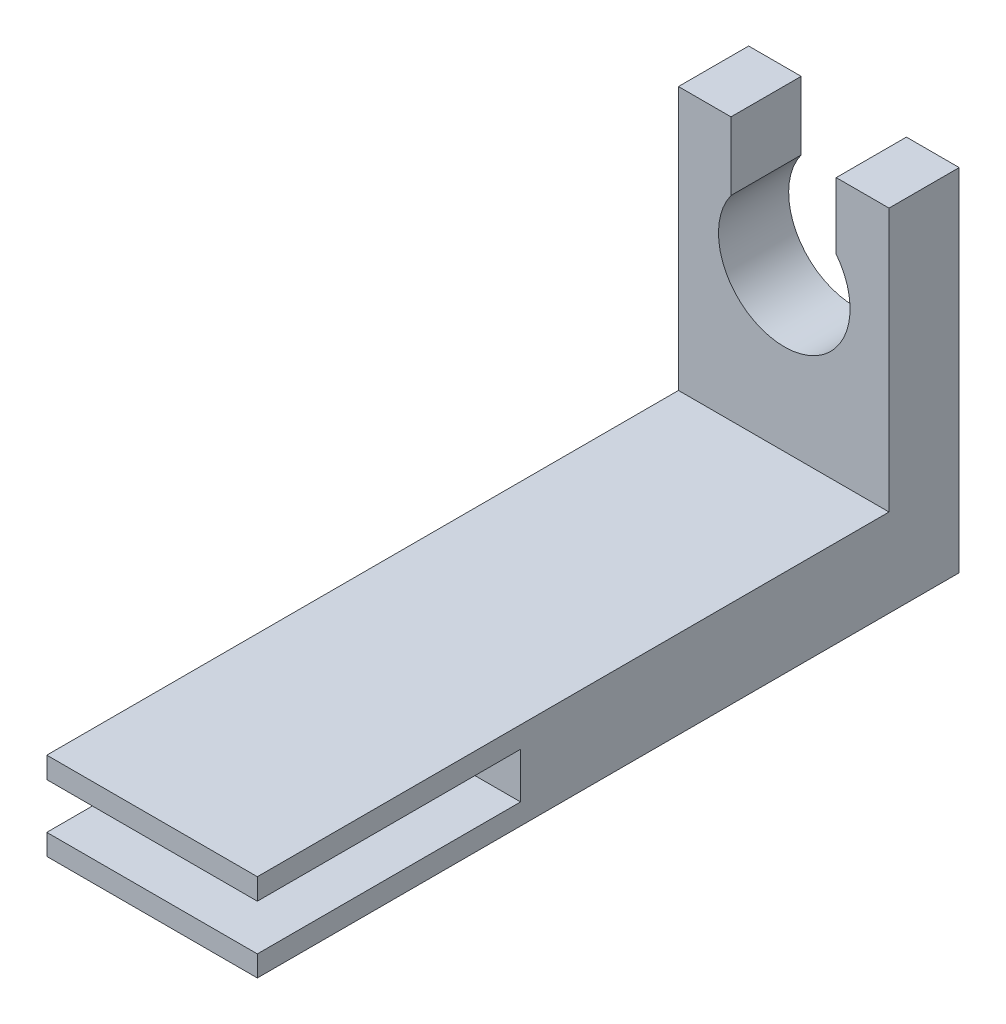
ISO-10303-21;
HEADER;
FILE_DESCRIPTION(('STEP AP214'),'2;1');
FILE_NAME('part.step','',(''),(''),'','','');
FILE_SCHEMA(('AUTOMOTIVE_DESIGN { 1 0 10303 214 1 1 1 1 }'));
ENDSEC;
DATA;
#1=APPLICATION_CONTEXT('core data for automotive mechanical design processes');
#2=APPLICATION_PROTOCOL_DEFINITION('international standard','automotive_design',2000,#1);
#3=PRODUCT_CONTEXT('',#1,'mechanical');
#4=PRODUCT('Part','Part','',(#3));
#5=PRODUCT_RELATED_PRODUCT_CATEGORY('part','',(#4));
#6=PRODUCT_DEFINITION_FORMATION('','',#4);
#7=PRODUCT_DEFINITION_CONTEXT('part definition',#1,'design');
#8=PRODUCT_DEFINITION('design','',#6,#7);
#9=PRODUCT_DEFINITION_SHAPE('','',#8);
#10=(LENGTH_UNIT() NAMED_UNIT(*) SI_UNIT(.MILLI.,.METRE.));
#11=(NAMED_UNIT(*) PLANE_ANGLE_UNIT() SI_UNIT($,.RADIAN.));
#12=(NAMED_UNIT(*) SI_UNIT($,.STERADIAN.) SOLID_ANGLE_UNIT());
#13=UNCERTAINTY_MEASURE_WITH_UNIT(LENGTH_MEASURE(1.E-05),#10,'distance_accuracy_value','');
#14=(GEOMETRIC_REPRESENTATION_CONTEXT(3) GLOBAL_UNCERTAINTY_ASSIGNED_CONTEXT((#13)) GLOBAL_UNIT_ASSIGNED_CONTEXT((#10,
#11,#12)) REPRESENTATION_CONTEXT('',''));
#15=CARTESIAN_POINT('',(0.,0.,0.));
#16=DIRECTION('',(0.,0.,1.));
#17=DIRECTION('',(1.,0.,0.));
#18=AXIS2_PLACEMENT_3D('',#15,#16,#17);
#19=CARTESIAN_POINT('',(0.,20.,0.));
#20=DIRECTION('',(0.,1.,0.));
#21=DIRECTION('',(0.,0.,1.));
#22=AXIS2_PLACEMENT_3D('',#19,#20,#21);
#23=PLANE('',#22);
#24=DIRECTION('',(0.,0.,-1.));
#25=VECTOR('',#24,1.);
#26=CARTESIAN_POINT('',(-6.77393710682441,20.,-33.0588235294118));
#27=LINE('',#26,#25);
#28=CARTESIAN_POINT('',(-6.77393710682441,20.,-39.0588235294118));
#29=VERTEX_POINT('',#28);
#30=CARTESIAN_POINT('',(-6.77393710682441,20.,-43.0588235294118));
#31=VERTEX_POINT('',#30);
#32=EDGE_CURVE('E284',#29,#31,#27,.T.);
#33=ORIENTED_EDGE('',*,*,#32,.F.);
#34=DIRECTION('',(1.,0.,0.));
#35=VECTOR('',#34,1.);
#36=CARTESIAN_POINT('',(-15.764705882353,20.,-39.0588235294118));
#37=LINE('',#36,#35);
#38=CARTESIAN_POINT('',(-3.76470588235294,20.,-39.0588235294118));
#39=VERTEX_POINT('',#38);
#40=EDGE_CURVE('E165',#29,#39,#37,.T.);
#41=ORIENTED_EDGE('',*,*,#40,.T.);
#42=DIRECTION('',(0.,0.,-1.));
#43=VECTOR('',#42,1.);
#44=CARTESIAN_POINT('',(-3.76470588235294,20.,-43.0588235294118));
#45=LINE('',#44,#43);
#46=CARTESIAN_POINT('',(-3.76470588235294,20.,-43.0588235294118));
#47=VERTEX_POINT('',#46);
#48=EDGE_CURVE('E169',#39,#47,#45,.T.);
#49=ORIENTED_EDGE('',*,*,#48,.T.);
#50=DIRECTION('',(-1.,0.,0.));
#51=VECTOR('',#50,1.);
#52=CARTESIAN_POINT('',(-15.764705882353,20.,-43.0588235294118));
#53=LINE('',#52,#51);
#54=EDGE_CURVE('E172',#47,#31,#53,.T.);
#55=ORIENTED_EDGE('',*,*,#54,.T.);
#56=EDGE_LOOP('',(#33,#41,#49,#55));
#57=FACE_BOUND('',#56,.T.);
#58=ADVANCED_FACE('F37',(#57),#23,.T.);
#59=CARTESIAN_POINT('',(-15.7647058823529,5.,-3.05882352941177));
#60=DIRECTION('',(0.,0.,-1.));
#61=DIRECTION('',(-1.,0.,0.));
#62=AXIS2_PLACEMENT_3D('',#59,#60,#61);
#63=PLANE('',#62);
#64=DIRECTION('',(0.,-1.,0.));
#65=VECTOR('',#64,1.);
#66=CARTESIAN_POINT('',(-3.76470588235294,5.,-3.05882352941177));
#67=LINE('',#66,#65);
#68=CARTESIAN_POINT('',(-3.76470588235294,1.18956511839395,-3.05882352941177));
#69=VERTEX_POINT('',#68);
#70=CARTESIAN_POINT('',(-3.76470588235294,0.,-3.05882352941177));
#71=VERTEX_POINT('',#70);
#72=EDGE_CURVE('E212',#69,#71,#67,.T.);
#73=ORIENTED_EDGE('',*,*,#72,.F.);
#74=DIRECTION('',(-1.,0.,0.));
#75=VECTOR('',#74,1.);
#76=CARTESIAN_POINT('',(-15.7647058823529,1.18956511839395,-3.05882352941177));
#77=LINE('',#76,#75);
#78=CARTESIAN_POINT('',(-15.7647058823529,1.18956511839395,-3.05882352941177));
#79=VERTEX_POINT('',#78);
#80=EDGE_CURVE('E235',#69,#79,#77,.T.);
#81=ORIENTED_EDGE('',*,*,#80,.T.);
#82=DIRECTION('',(0.,-1.,0.));
#83=VECTOR('',#82,1.);
#84=CARTESIAN_POINT('',(-15.7647058823529,5.,-3.05882352941177));
#85=LINE('',#84,#83);
#86=CARTESIAN_POINT('',(-15.7647058823529,0.,-3.05882352941177));
#87=VERTEX_POINT('',#86);
#88=EDGE_CURVE('E225',#79,#87,#85,.T.);
#89=ORIENTED_EDGE('',*,*,#88,.T.);
#90=DIRECTION('',(1.,0.,0.));
#91=VECTOR('',#90,1.);
#92=CARTESIAN_POINT('',(-15.7647058823529,0.,-3.05882352941177));
#93=LINE('',#92,#91);
#94=EDGE_CURVE('E208',#87,#71,#93,.T.);
#95=ORIENTED_EDGE('',*,*,#94,.T.);
#96=EDGE_LOOP('',(#73,#81,#89,#95));
#97=FACE_BOUND('',#96,.T.);
#98=ADVANCED_FACE('F277',(#97),#63,.F.);
#99=CARTESIAN_POINT('',(-3.76470588235294,5.,-43.0588235294118));
#100=DIRECTION('',(-1.,0.,0.));
#101=DIRECTION('',(0.,0.,1.));
#102=AXIS2_PLACEMENT_3D('',#99,#100,#101);
#103=PLANE('',#102);
#104=DIRECTION('',(0.,1.,0.));
#105=VECTOR('',#104,1.);
#106=CARTESIAN_POINT('',(-3.76470588235294,1.18956511839395,-18.0588235294118));
#107=LINE('',#106,#105);
#108=CARTESIAN_POINT('',(-3.76470588235294,1.18956511839395,-18.0588235294118));
#109=VERTEX_POINT('',#108);
#110=CARTESIAN_POINT('',(-3.76470588235294,3.78956511839395,-18.0588235294118));
#111=VERTEX_POINT('',#110);
#112=EDGE_CURVE('E184',#109,#111,#107,.T.);
#113=ORIENTED_EDGE('',*,*,#112,.F.);
#114=DIRECTION('',(0.,0.,1.));
#115=VECTOR('',#114,1.);
#116=CARTESIAN_POINT('',(-3.76470588235294,1.18956511839395,-18.0588235294118));
#117=LINE('',#116,#115);
#118=EDGE_CURVE('E194',#109,#69,#117,.T.);
#119=ORIENTED_EDGE('',*,*,#118,.T.);
#120=ORIENTED_EDGE('',*,*,#72,.T.);
#121=DIRECTION('',(0.,0.,-1.));
#122=VECTOR('',#121,1.);
#123=CARTESIAN_POINT('',(-3.76470588235294,0.,-43.0588235294118));
#124=LINE('',#123,#122);
#125=CARTESIAN_POINT('',(-3.76470588235294,0.,-43.0588235294118));
#126=VERTEX_POINT('',#125);
#127=EDGE_CURVE('E204',#71,#126,#124,.T.);
#128=ORIENTED_EDGE('',*,*,#127,.T.);
#129=DIRECTION('',(0.,-1.,0.));
#130=VECTOR('',#129,1.);
#131=CARTESIAN_POINT('',(-3.76470588235294,5.,-43.0588235294118));
#132=LINE('',#131,#130);
#133=EDGE_CURVE('E232',#47,#126,#132,.T.);
#134=ORIENTED_EDGE('',*,*,#133,.F.);
#135=ORIENTED_EDGE('',*,*,#48,.F.);
#136=DIRECTION('',(0.,-1.,0.));
#137=VECTOR('',#136,1.);
#138=CARTESIAN_POINT('',(-3.76470588235294,20.,-39.0588235294118));
#139=LINE('',#138,#137);
#140=CARTESIAN_POINT('',(-3.76470588235294,5.,-39.0588235294118));
#141=VERTEX_POINT('',#140);
#142=EDGE_CURVE('E175',#39,#141,#139,.T.);
#143=ORIENTED_EDGE('',*,*,#142,.T.);
#144=DIRECTION('',(0.,0.,-1.));
#145=VECTOR('',#144,1.);
#146=CARTESIAN_POINT('',(-3.76470588235294,5.,-43.0588235294118));
#147=LINE('',#146,#145);
#148=CARTESIAN_POINT('',(-3.76470588235294,5.,-3.05882352941177));
#149=VERTEX_POINT('',#148);
#150=EDGE_CURVE('E205',#149,#141,#147,.T.);
#151=ORIENTED_EDGE('',*,*,#150,.F.);
#152=CARTESIAN_POINT('',(-3.76470588235294,3.78956511839395,-3.05882352941177));
#153=VERTEX_POINT('',#152);
#154=EDGE_CURVE('E222',#149,#153,#67,.T.);
#155=ORIENTED_EDGE('',*,*,#154,.T.);
#156=DIRECTION('',(0.,0.,1.));
#157=VECTOR('',#156,1.);
#158=CARTESIAN_POINT('',(-3.76470588235294,3.78956511839395,-18.0588235294118));
#159=LINE('',#158,#157);
#160=EDGE_CURVE('E192',#111,#153,#159,.T.);
#161=ORIENTED_EDGE('',*,*,#160,.F.);
#162=EDGE_LOOP('',(#113,#119,#120,#128,#134,#135,#143,#151,#155,#161));
#163=FACE_BOUND('',#162,.T.);
#164=ADVANCED_FACE('F39',(#163),#103,.F.);
#165=CARTESIAN_POINT('',(-15.764705882353,5.,-43.0588235294118));
#166=DIRECTION('',(0.,0.,1.));
#167=DIRECTION('',(1.,0.,0.));
#168=AXIS2_PLACEMENT_3D('',#165,#166,#167);
#169=PLANE('',#168);
#170=CARTESIAN_POINT('',(-9.73479819459766,13.9179070959425,-43.0588235294118));
#171=DIRECTION('',(0.,0.,-1.));
#172=DIRECTION('',(-1.,0.,0.));
#173=AXIS2_PLACEMENT_3D('',#170,#171,#172);
#174=CIRCLE('',#173,3.75);
#175=CARTESIAN_POINT('',(-6.77393710682441,16.2191679718343,-43.0588235294118));
#176=VERTEX_POINT('',#175);
#177=CARTESIAN_POINT('',(-12.7715734738966,16.1180197982918,-43.0588235294118));
#178=VERTEX_POINT('',#177);
#179=EDGE_CURVE('E147',#176,#178,#174,.T.);
#180=ORIENTED_EDGE('',*,*,#179,.F.);
#181=DIRECTION('',(0.,-1.,0.));
#182=VECTOR('',#181,1.);
#183=CARTESIAN_POINT('',(-6.77393710682441,20.,-43.0588235294118));
#184=LINE('',#183,#182);
#185=EDGE_CURVE('E60',#31,#176,#184,.T.);
#186=ORIENTED_EDGE('',*,*,#185,.F.);
#187=ORIENTED_EDGE('',*,*,#54,.F.);
#188=ORIENTED_EDGE('',*,*,#133,.T.);
#189=DIRECTION('',(-1.,0.,0.));
#190=VECTOR('',#189,1.);
#191=CARTESIAN_POINT('',(-15.764705882353,0.,-43.0588235294118));
#192=LINE('',#191,#190);
#193=CARTESIAN_POINT('',(-15.764705882353,0.,-43.0588235294118));
#194=VERTEX_POINT('',#193);
#195=EDGE_CURVE('E215',#126,#194,#192,.T.);
#196=ORIENTED_EDGE('',*,*,#195,.T.);
#197=DIRECTION('',(0.,-1.,0.));
#198=VECTOR('',#197,1.);
#199=CARTESIAN_POINT('',(-15.764705882353,5.,-43.0588235294118));
#200=LINE('',#199,#198);
#201=CARTESIAN_POINT('',(-15.764705882353,20.,-43.0588235294118));
#202=VERTEX_POINT('',#201);
#203=EDGE_CURVE('E229',#202,#194,#200,.T.);
#204=ORIENTED_EDGE('',*,*,#203,.F.);
#205=CARTESIAN_POINT('',(-12.7715734738966,20.,-43.0588235294118));
#206=VERTEX_POINT('',#205);
#207=EDGE_CURVE('E149',#206,#202,#53,.T.);
#208=ORIENTED_EDGE('',*,*,#207,.F.);
#209=DIRECTION('',(0.,1.,0.));
#210=VECTOR('',#209,1.);
#211=CARTESIAN_POINT('',(-12.7715734738966,20.,-43.0588235294118));
#212=LINE('',#211,#210);
#213=EDGE_CURVE('E136',#178,#206,#212,.T.);
#214=ORIENTED_EDGE('',*,*,#213,.F.);
#215=EDGE_LOOP('',(#180,#186,#187,#188,#196,#204,#208,#214));
#216=FACE_BOUND('',#215,.T.);
#217=ADVANCED_FACE('F146',(#216),#169,.F.);
#218=CARTESIAN_POINT('',(-15.764705882353,5.,-43.0588235294118));
#219=DIRECTION('',(1.,0.,0.));
#220=DIRECTION('',(0.,0.,-1.));
#221=AXIS2_PLACEMENT_3D('',#218,#219,#220);
#222=PLANE('',#221);
#223=ORIENTED_EDGE('',*,*,#88,.F.);
#224=DIRECTION('',(0.,0.,-1.));
#225=VECTOR('',#224,1.);
#226=CARTESIAN_POINT('',(-15.764705882353,1.18956511839395,-43.0588235294118));
#227=LINE('',#226,#225);
#228=CARTESIAN_POINT('',(-15.7647058823529,1.18956511839395,-18.0588235294118));
#229=VERTEX_POINT('',#228);
#230=EDGE_CURVE('E201',#79,#229,#227,.T.);
#231=ORIENTED_EDGE('',*,*,#230,.T.);
#232=DIRECTION('',(0.,1.,0.));
#233=VECTOR('',#232,1.);
#234=CARTESIAN_POINT('',(-15.7647058823529,5.,-18.0588235294118));
#235=LINE('',#234,#233);
#236=CARTESIAN_POINT('',(-15.7647058823529,3.78956511839395,-18.0588235294118));
#237=VERTEX_POINT('',#236);
#238=EDGE_CURVE('E142',#229,#237,#235,.T.);
#239=ORIENTED_EDGE('',*,*,#238,.T.);
#240=DIRECTION('',(0.,0.,1.));
#241=VECTOR('',#240,1.);
#242=CARTESIAN_POINT('',(-15.764705882353,3.78956511839395,-43.0588235294118));
#243=LINE('',#242,#241);
#244=CARTESIAN_POINT('',(-15.7647058823529,3.78956511839395,-3.05882352941177));
#245=VERTEX_POINT('',#244);
#246=EDGE_CURVE('E197',#237,#245,#243,.T.);
#247=ORIENTED_EDGE('',*,*,#246,.T.);
#248=CARTESIAN_POINT('',(-15.7647058823529,5.,-3.05882352941177));
#249=VERTEX_POINT('',#248);
#250=EDGE_CURVE('E226',#249,#245,#85,.T.);
#251=ORIENTED_EDGE('',*,*,#250,.F.);
#252=DIRECTION('',(0.,0.,1.));
#253=VECTOR('',#252,1.);
#254=CARTESIAN_POINT('',(-15.764705882353,5.,-43.0588235294118));
#255=LINE('',#254,#253);
#256=CARTESIAN_POINT('',(-15.764705882353,5.,-39.0588235294118));
#257=VERTEX_POINT('',#256);
#258=EDGE_CURVE('E207',#257,#249,#255,.T.);
#259=ORIENTED_EDGE('',*,*,#258,.F.);
#260=DIRECTION('',(0.,-1.,0.));
#261=VECTOR('',#260,1.);
#262=CARTESIAN_POINT('',(-15.764705882353,20.,-39.0588235294118));
#263=LINE('',#262,#261);
#264=CARTESIAN_POINT('',(-15.764705882353,20.,-39.0588235294118));
#265=VERTEX_POINT('',#264);
#266=EDGE_CURVE('E180',#265,#257,#263,.T.);
#267=ORIENTED_EDGE('',*,*,#266,.F.);
#268=DIRECTION('',(0.,0.,1.));
#269=VECTOR('',#268,1.);
#270=CARTESIAN_POINT('',(-15.764705882353,20.,-43.0588235294118));
#271=LINE('',#270,#269);
#272=EDGE_CURVE('E162',#202,#265,#271,.T.);
#273=ORIENTED_EDGE('',*,*,#272,.F.);
#274=ORIENTED_EDGE('',*,*,#203,.T.);
#275=DIRECTION('',(0.,0.,1.));
#276=VECTOR('',#275,1.);
#277=CARTESIAN_POINT('',(-15.764705882353,0.,-43.0588235294118));
#278=LINE('',#277,#276);
#279=EDGE_CURVE('E217',#194,#87,#278,.T.);
#280=ORIENTED_EDGE('',*,*,#279,.T.);
#281=EDGE_LOOP('',(#223,#231,#239,#247,#251,#259,#267,#273,#274,#280));
#282=FACE_BOUND('',#281,.T.);
#283=ADVANCED_FACE('F241',(#282),#222,.F.);
#284=ORIENTED_EDGE('',*,*,#250,.T.);
#285=DIRECTION('',(-1.,0.,0.));
#286=VECTOR('',#285,1.);
#287=CARTESIAN_POINT('',(-15.7688101432617,3.78956511839395,-3.05882352941177));
#288=LINE('',#287,#286);
#289=EDGE_CURVE('E183',#153,#245,#288,.T.);
#290=ORIENTED_EDGE('',*,*,#289,.F.);
#291=ORIENTED_EDGE('',*,*,#154,.F.);
#292=DIRECTION('',(1.,0.,0.));
#293=VECTOR('',#292,1.);
#294=CARTESIAN_POINT('',(-15.7647058823529,5.,-3.05882352941177));
#295=LINE('',#294,#293);
#296=EDGE_CURVE('E210',#249,#149,#295,.T.);
#297=ORIENTED_EDGE('',*,*,#296,.F.);
#298=EDGE_LOOP('',(#284,#290,#291,#297));
#299=FACE_BOUND('',#298,.T.);
#300=ADVANCED_FACE('F259',(#299),#63,.F.);
#301=CARTESIAN_POINT('',(0.,5.,0.));
#302=DIRECTION('',(0.,1.,0.));
#303=DIRECTION('',(0.,0.,1.));
#304=AXIS2_PLACEMENT_3D('',#301,#302,#303);
#305=PLANE('',#304);
#306=DIRECTION('',(1.,0.,0.));
#307=VECTOR('',#306,1.);
#308=CARTESIAN_POINT('',(-15.764705882353,5.,-39.0588235294118));
#309=LINE('',#308,#307);
#310=EDGE_CURVE('E156',#257,#141,#309,.T.);
#311=ORIENTED_EDGE('',*,*,#310,.F.);
#312=ORIENTED_EDGE('',*,*,#258,.T.);
#313=ORIENTED_EDGE('',*,*,#296,.T.);
#314=ORIENTED_EDGE('',*,*,#150,.T.);
#315=EDGE_LOOP('',(#311,#312,#313,#314));
#316=FACE_BOUND('',#315,.T.);
#317=ADVANCED_FACE('F287',(#316),#305,.T.);
#318=CARTESIAN_POINT('',(0.,0.,0.));
#319=DIRECTION('',(0.,1.,0.));
#320=DIRECTION('',(0.,0.,1.));
#321=AXIS2_PLACEMENT_3D('',#318,#319,#320);
#322=PLANE('',#321);
#323=ORIENTED_EDGE('',*,*,#127,.F.);
#324=ORIENTED_EDGE('',*,*,#94,.F.);
#325=ORIENTED_EDGE('',*,*,#279,.F.);
#326=ORIENTED_EDGE('',*,*,#195,.F.);
#327=EDGE_LOOP('',(#323,#324,#325,#326));
#328=FACE_BOUND('',#327,.T.);
#329=ADVANCED_FACE('F275',(#328),#322,.F.);
#330=CARTESIAN_POINT('',(0.,0.,-18.0588235294118));
#331=DIRECTION('',(0.,0.,-1.));
#332=DIRECTION('',(-1.,0.,0.));
#333=AXIS2_PLACEMENT_3D('',#330,#331,#332);
#334=PLANE('',#333);
#335=DIRECTION('',(1.,0.,0.));
#336=VECTOR('',#335,1.);
#337=CARTESIAN_POINT('',(-15.7688101432617,1.18956511839395,-18.0588235294118));
#338=LINE('',#337,#336);
#339=EDGE_CURVE('E190',#229,#109,#338,.T.);
#340=ORIENTED_EDGE('',*,*,#339,.T.);
#341=ORIENTED_EDGE('',*,*,#112,.T.);
#342=DIRECTION('',(-1.,0.,0.));
#343=VECTOR('',#342,1.);
#344=CARTESIAN_POINT('',(-15.7688101432617,3.78956511839395,-18.0588235294118));
#345=LINE('',#344,#343);
#346=EDGE_CURVE('E187',#111,#237,#345,.T.);
#347=ORIENTED_EDGE('',*,*,#346,.T.);
#348=ORIENTED_EDGE('',*,*,#238,.F.);
#349=EDGE_LOOP('',(#340,#341,#347,#348));
#350=FACE_BOUND('',#349,.T.);
#351=ADVANCED_FACE('F245',(#350),#334,.F.);
#352=CARTESIAN_POINT('',(-15.7688101432617,1.18956511839395,-18.0588235294118));
#353=DIRECTION('',(0.,-1.,0.));
#354=DIRECTION('',(0.,0.,-1.));
#355=AXIS2_PLACEMENT_3D('',#352,#353,#354);
#356=PLANE('',#355);
#357=ORIENTED_EDGE('',*,*,#80,.F.);
#358=ORIENTED_EDGE('',*,*,#118,.F.);
#359=ORIENTED_EDGE('',*,*,#339,.F.);
#360=ORIENTED_EDGE('',*,*,#230,.F.);
#361=EDGE_LOOP('',(#357,#358,#359,#360));
#362=FACE_BOUND('',#361,.T.);
#363=ADVANCED_FACE('F248',(#362),#356,.F.);
#364=CARTESIAN_POINT('',(-15.7688101432617,3.78956511839395,-18.0588235294118));
#365=DIRECTION('',(0.,1.,0.));
#366=DIRECTION('',(0.,0.,1.));
#367=AXIS2_PLACEMENT_3D('',#364,#365,#366);
#368=PLANE('',#367);
#369=ORIENTED_EDGE('',*,*,#346,.F.);
#370=ORIENTED_EDGE('',*,*,#160,.T.);
#371=ORIENTED_EDGE('',*,*,#289,.T.);
#372=ORIENTED_EDGE('',*,*,#246,.F.);
#373=EDGE_LOOP('',(#369,#370,#371,#372));
#374=FACE_BOUND('',#373,.T.);
#375=ADVANCED_FACE('F257',(#374),#368,.F.);
#376=CARTESIAN_POINT('',(-15.764705882353,20.,-39.0588235294118));
#377=DIRECTION('',(0.,0.,-1.));
#378=DIRECTION('',(-1.,0.,0.));
#379=AXIS2_PLACEMENT_3D('',#376,#377,#378);
#380=PLANE('',#379);
#381=ORIENTED_EDGE('',*,*,#40,.F.);
#382=DIRECTION('',(0.,-1.,0.));
#383=VECTOR('',#382,1.);
#384=CARTESIAN_POINT('',(-6.77393710682441,20.,-39.0588235294118));
#385=LINE('',#384,#383);
#386=CARTESIAN_POINT('',(-6.77393710682441,16.2191679718343,-39.0588235294118));
#387=VERTEX_POINT('',#386);
#388=EDGE_CURVE('E154',#29,#387,#385,.T.);
#389=ORIENTED_EDGE('',*,*,#388,.T.);
#390=CARTESIAN_POINT('',(-9.73479819459766,13.9179070959425,-39.0588235294118));
#391=DIRECTION('',(0.,0.,-1.));
#392=DIRECTION('',(-1.,0.,0.));
#393=AXIS2_PLACEMENT_3D('',#390,#391,#392);
#394=CIRCLE('',#393,3.75);
#395=CARTESIAN_POINT('',(-12.7715734738966,16.1180197982918,-39.0588235294118));
#396=VERTEX_POINT('',#395);
#397=EDGE_CURVE('E153',#387,#396,#394,.T.);
#398=ORIENTED_EDGE('',*,*,#397,.T.);
#399=DIRECTION('',(0.,1.,0.));
#400=VECTOR('',#399,1.);
#401=CARTESIAN_POINT('',(-12.7715734738966,20.,-39.0588235294118));
#402=LINE('',#401,#400);
#403=CARTESIAN_POINT('',(-12.7715734738966,20.,-39.0588235294118));
#404=VERTEX_POINT('',#403);
#405=EDGE_CURVE('E52',#396,#404,#402,.T.);
#406=ORIENTED_EDGE('',*,*,#405,.T.);
#407=EDGE_CURVE('E166',#265,#404,#37,.T.);
#408=ORIENTED_EDGE('',*,*,#407,.F.);
#409=ORIENTED_EDGE('',*,*,#266,.T.);
#410=ORIENTED_EDGE('',*,*,#310,.T.);
#411=ORIENTED_EDGE('',*,*,#142,.F.);
#412=EDGE_LOOP('',(#381,#389,#398,#406,#408,#409,#410,#411));
#413=FACE_BOUND('',#412,.T.);
#414=ADVANCED_FACE('F267',(#413),#380,.F.);
#415=DIRECTION('',(0.,0.,-1.));
#416=VECTOR('',#415,1.);
#417=CARTESIAN_POINT('',(-12.7715734738966,20.,-33.0588235294118));
#418=LINE('',#417,#416);
#419=EDGE_CURVE('E150',#404,#206,#418,.T.);
#420=ORIENTED_EDGE('',*,*,#419,.T.);
#421=ORIENTED_EDGE('',*,*,#207,.T.);
#422=ORIENTED_EDGE('',*,*,#272,.T.);
#423=ORIENTED_EDGE('',*,*,#407,.T.);
#424=EDGE_LOOP('',(#420,#421,#422,#423));
#425=FACE_BOUND('',#424,.T.);
#426=ADVANCED_FACE('F270',(#425),#23,.T.);
#427=CARTESIAN_POINT('',(-9.73479819459766,13.9179070959425,-28.0588235294118));
#428=DIRECTION('',(0.,0.,-1.));
#429=DIRECTION('',(-1.,0.,0.));
#430=AXIS2_PLACEMENT_3D('',#427,#428,#429);
#431=CYLINDRICAL_SURFACE('',#430,3.75);
#432=ORIENTED_EDGE('',*,*,#397,.F.);
#433=DIRECTION('',(0.,0.,-1.));
#434=VECTOR('',#433,1.);
#435=CARTESIAN_POINT('',(-6.77393710682441,16.2191679718343,-28.0588235294118));
#436=LINE('',#435,#434);
#437=EDGE_CURVE('E11',#387,#176,#436,.T.);
#438=ORIENTED_EDGE('',*,*,#437,.T.);
#439=ORIENTED_EDGE('',*,*,#179,.T.);
#440=DIRECTION('',(0.,0.,-1.));
#441=VECTOR('',#440,1.);
#442=CARTESIAN_POINT('',(-12.7715734738966,16.1180197982918,-28.0588235294118));
#443=LINE('',#442,#441);
#444=EDGE_CURVE('E45',#178,#396,#443,.F.);
#445=ORIENTED_EDGE('',*,*,#444,.T.);
#446=EDGE_LOOP('',(#432,#438,#439,#445));
#447=FACE_BOUND('',#446,.T.);
#448=ADVANCED_FACE('F152',(#447),#431,.F.);
#449=CARTESIAN_POINT('',(-12.7715734738966,20.,-33.0588235294118));
#450=DIRECTION('',(-1.,0.,0.));
#451=DIRECTION('',(0.,0.,1.));
#452=AXIS2_PLACEMENT_3D('',#449,#450,#451);
#453=PLANE('',#452);
#454=ORIENTED_EDGE('',*,*,#444,.F.);
#455=ORIENTED_EDGE('',*,*,#213,.T.);
#456=ORIENTED_EDGE('',*,*,#419,.F.);
#457=ORIENTED_EDGE('',*,*,#405,.F.);
#458=EDGE_LOOP('',(#454,#455,#456,#457));
#459=FACE_BOUND('',#458,.T.);
#460=ADVANCED_FACE('F135',(#459),#453,.F.);
#461=CARTESIAN_POINT('',(-6.77393710682441,20.,-33.0588235294118));
#462=DIRECTION('',(1.,0.,0.));
#463=DIRECTION('',(0.,0.,-1.));
#464=AXIS2_PLACEMENT_3D('',#461,#462,#463);
#465=PLANE('',#464);
#466=ORIENTED_EDGE('',*,*,#32,.T.);
#467=ORIENTED_EDGE('',*,*,#185,.T.);
#468=ORIENTED_EDGE('',*,*,#437,.F.);
#469=ORIENTED_EDGE('',*,*,#388,.F.);
#470=EDGE_LOOP('',(#466,#467,#468,#469));
#471=FACE_BOUND('',#470,.T.);
#472=ADVANCED_FACE('F286',(#471),#465,.F.);
#473=CLOSED_SHELL('',(#58,#98,#164,#217,#283,#300,#317,#329,#351,#363,#375,#414,#426,#448,#460,#472));
#474=MANIFOLD_SOLID_BREP('B2',#473);
#475=ADVANCED_BREP_SHAPE_REPRESENTATION('',(#18,#474),#14);
#476=SHAPE_DEFINITION_REPRESENTATION(#9,#475);
ENDSEC;
END-ISO-10303-21;
